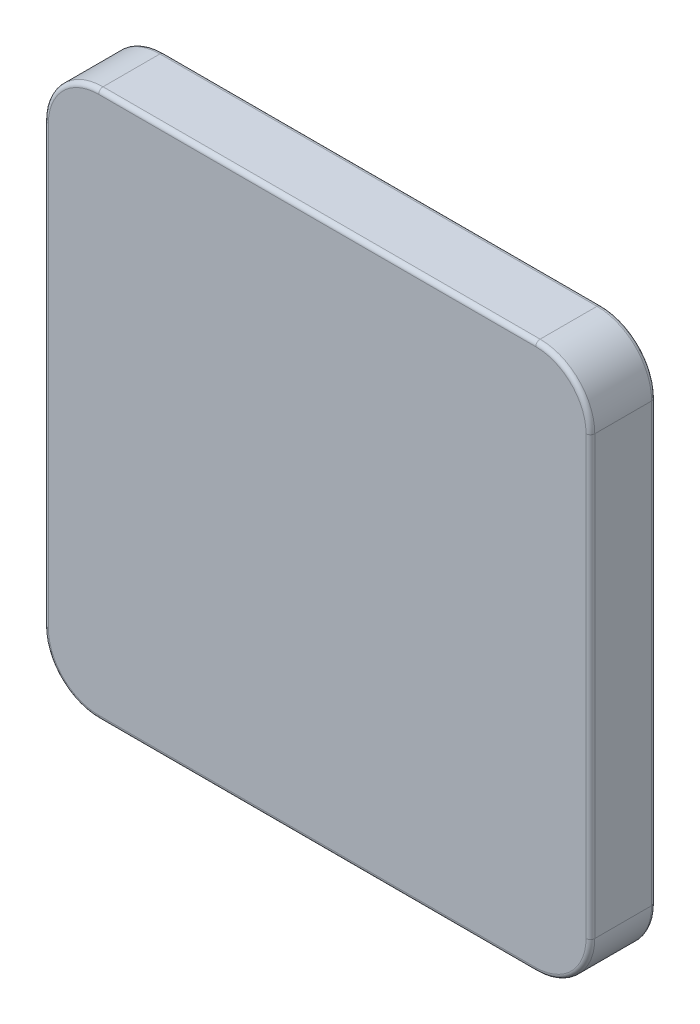
ISO-10303-21;
HEADER;
FILE_DESCRIPTION(('STEP AP214'),'2;1');
FILE_NAME('part.step','',(''),(''),'','','');
FILE_SCHEMA(('AUTOMOTIVE_DESIGN { 1 0 10303 214 1 1 1 1 }'));
ENDSEC;
DATA;
#1=APPLICATION_CONTEXT('core data for automotive mechanical design processes');
#2=APPLICATION_PROTOCOL_DEFINITION('international standard','automotive_design',2000,#1);
#3=PRODUCT_CONTEXT('',#1,'mechanical');
#4=PRODUCT('Part','Part','',(#3));
#5=PRODUCT_RELATED_PRODUCT_CATEGORY('part','',(#4));
#6=PRODUCT_DEFINITION_FORMATION('','',#4);
#7=PRODUCT_DEFINITION_CONTEXT('part definition',#1,'design');
#8=PRODUCT_DEFINITION('design','',#6,#7);
#9=PRODUCT_DEFINITION_SHAPE('','',#8);
#10=(LENGTH_UNIT() NAMED_UNIT(*) SI_UNIT(.MILLI.,.METRE.));
#11=(NAMED_UNIT(*) PLANE_ANGLE_UNIT() SI_UNIT($,.RADIAN.));
#12=(NAMED_UNIT(*) SI_UNIT($,.STERADIAN.) SOLID_ANGLE_UNIT());
#13=UNCERTAINTY_MEASURE_WITH_UNIT(LENGTH_MEASURE(1.E-05),#10,'distance_accuracy_value','');
#14=(GEOMETRIC_REPRESENTATION_CONTEXT(3) GLOBAL_UNCERTAINTY_ASSIGNED_CONTEXT((#13)) GLOBAL_UNIT_ASSIGNED_CONTEXT((#10,
#11,#12)) REPRESENTATION_CONTEXT('',''));
#15=CARTESIAN_POINT('',(0.,0.,0.));
#16=DIRECTION('',(0.,0.,1.));
#17=DIRECTION('',(1.,0.,0.));
#18=AXIS2_PLACEMENT_3D('',#15,#16,#17);
#19=CARTESIAN_POINT('',(-1016.,1016.,304.8));
#20=DIRECTION('',(0.,0.,-1.));
#21=DIRECTION('',(-1.,0.,0.));
#22=AXIS2_PLACEMENT_3D('',#19,#20,#21);
#23=CYLINDRICAL_SURFACE('',#22,254.);
#24=DIRECTION('',(0.,0.,-1.));
#25=VECTOR('',#24,1.);
#26=CARTESIAN_POINT('',(-1016.,1270.,304.8));
#27=LINE('',#26,#25);
#28=CARTESIAN_POINT('',(-1016.,1270.,284.48));
#29=VERTEX_POINT('',#28);
#30=CARTESIAN_POINT('',(-1016.,1270.,20.3200000000001));
#31=VERTEX_POINT('',#30);
#32=EDGE_CURVE('E239',#29,#31,#27,.T.);
#33=ORIENTED_EDGE('',*,*,#32,.T.);
#34=CARTESIAN_POINT('',(-1016.,1016.,20.32));
#35=DIRECTION('',(0.,0.,-1.));
#36=DIRECTION('',(-1.,0.,0.));
#37=AXIS2_PLACEMENT_3D('',#34,#35,#36);
#38=CIRCLE('',#37,254.);
#39=CARTESIAN_POINT('',(-1270.,1016.,20.3200000000001));
#40=VERTEX_POINT('',#39);
#41=EDGE_CURVE('E11',#31,#40,#38,.F.);
#42=ORIENTED_EDGE('',*,*,#41,.T.);
#43=DIRECTION('',(0.,0.,-1.));
#44=VECTOR('',#43,1.);
#45=CARTESIAN_POINT('',(-1270.,1016.,304.8));
#46=LINE('',#45,#44);
#47=CARTESIAN_POINT('',(-1270.,1016.,284.48));
#48=VERTEX_POINT('',#47);
#49=EDGE_CURVE('E178',#48,#40,#46,.T.);
#50=ORIENTED_EDGE('',*,*,#49,.F.);
#51=CARTESIAN_POINT('',(-1016.,1016.,284.48));
#52=DIRECTION('',(0.,0.,-1.));
#53=DIRECTION('',(-1.,0.,0.));
#54=AXIS2_PLACEMENT_3D('',#51,#52,#53);
#55=CIRCLE('',#54,254.);
#56=EDGE_CURVE('E211',#48,#29,#55,.T.);
#57=ORIENTED_EDGE('',*,*,#56,.T.);
#58=EDGE_LOOP('',(#33,#42,#50,#57));
#59=FACE_BOUND('',#58,.T.);
#60=ADVANCED_FACE('F39',(#59),#23,.T.);
#61=CARTESIAN_POINT('',(-1270.,1016.,304.8));
#62=DIRECTION('',(1.,0.,0.));
#63=DIRECTION('',(0.,1.,0.));
#64=AXIS2_PLACEMENT_3D('',#61,#62,#63);
#65=PLANE('',#64);
#66=ORIENTED_EDGE('',*,*,#49,.T.);
#67=DIRECTION('',(0.,-1.,0.));
#68=VECTOR('',#67,1.);
#69=CARTESIAN_POINT('',(-1270.,-1016.,20.32));
#70=LINE('',#69,#68);
#71=CARTESIAN_POINT('',(-1270.,-1016.,20.3200000000001));
#72=VERTEX_POINT('',#71);
#73=EDGE_CURVE('E213',#40,#72,#70,.T.);
#74=ORIENTED_EDGE('',*,*,#73,.T.);
#75=DIRECTION('',(0.,0.,-1.));
#76=VECTOR('',#75,1.);
#77=CARTESIAN_POINT('',(-1270.,-1016.,304.8));
#78=LINE('',#77,#76);
#79=CARTESIAN_POINT('',(-1270.,-1016.,284.48));
#80=VERTEX_POINT('',#79);
#81=EDGE_CURVE('E344',#80,#72,#78,.T.);
#82=ORIENTED_EDGE('',*,*,#81,.F.);
#83=DIRECTION('',(0.,-1.,0.));
#84=VECTOR('',#83,1.);
#85=CARTESIAN_POINT('',(-1270.,1016.,284.48));
#86=LINE('',#85,#84);
#87=EDGE_CURVE('E208',#80,#48,#86,.F.);
#88=ORIENTED_EDGE('',*,*,#87,.T.);
#89=EDGE_LOOP('',(#66,#74,#82,#88));
#90=FACE_BOUND('',#89,.T.);
#91=ADVANCED_FACE('F339',(#90),#65,.F.);
#92=CARTESIAN_POINT('',(-1016.,-1016.,304.8));
#93=DIRECTION('',(0.,0.,-1.));
#94=DIRECTION('',(-1.,0.,0.));
#95=AXIS2_PLACEMENT_3D('',#92,#93,#94);
#96=CYLINDRICAL_SURFACE('',#95,254.);
#97=ORIENTED_EDGE('',*,*,#81,.T.);
#98=CARTESIAN_POINT('',(-1016.,-1016.,20.32));
#99=DIRECTION('',(0.,0.,-1.));
#100=DIRECTION('',(-1.,0.,0.));
#101=AXIS2_PLACEMENT_3D('',#98,#99,#100);
#102=CIRCLE('',#101,254.);
#103=CARTESIAN_POINT('',(-1016.,-1270.,20.3200000000001));
#104=VERTEX_POINT('',#103);
#105=EDGE_CURVE('E268',#72,#104,#102,.F.);
#106=ORIENTED_EDGE('',*,*,#105,.T.);
#107=DIRECTION('',(0.,0.,-1.));
#108=VECTOR('',#107,1.);
#109=CARTESIAN_POINT('',(-1016.,-1270.,304.8));
#110=LINE('',#109,#108);
#111=CARTESIAN_POINT('',(-1016.,-1270.,284.48));
#112=VERTEX_POINT('',#111);
#113=EDGE_CURVE('E347',#112,#104,#110,.T.);
#114=ORIENTED_EDGE('',*,*,#113,.F.);
#115=CARTESIAN_POINT('',(-1016.,-1016.,284.48));
#116=DIRECTION('',(0.,0.,-1.));
#117=DIRECTION('',(-1.,0.,0.));
#118=AXIS2_PLACEMENT_3D('',#115,#116,#117);
#119=CIRCLE('',#118,254.);
#120=EDGE_CURVE('E205',#112,#80,#119,.T.);
#121=ORIENTED_EDGE('',*,*,#120,.T.);
#122=EDGE_LOOP('',(#97,#106,#114,#121));
#123=FACE_BOUND('',#122,.T.);
#124=ADVANCED_FACE('F425',(#123),#96,.T.);
#125=CARTESIAN_POINT('',(-1016.,-1270.,304.8));
#126=DIRECTION('',(0.,1.,0.));
#127=DIRECTION('',(0.,0.,1.));
#128=AXIS2_PLACEMENT_3D('',#125,#126,#127);
#129=PLANE('',#128);
#130=ORIENTED_EDGE('',*,*,#113,.T.);
#131=DIRECTION('',(1.,0.,0.));
#132=VECTOR('',#131,1.);
#133=CARTESIAN_POINT('',(1016.,-1270.,20.32));
#134=LINE('',#133,#132);
#135=CARTESIAN_POINT('',(1016.,-1270.,20.3200000000001));
#136=VERTEX_POINT('',#135);
#137=EDGE_CURVE('E271',#104,#136,#134,.T.);
#138=ORIENTED_EDGE('',*,*,#137,.T.);
#139=DIRECTION('',(0.,0.,-1.));
#140=VECTOR('',#139,1.);
#141=CARTESIAN_POINT('',(1016.,-1270.,304.8));
#142=LINE('',#141,#140);
#143=CARTESIAN_POINT('',(1016.,-1270.,284.48));
#144=VERTEX_POINT('',#143);
#145=EDGE_CURVE('E388',#144,#136,#142,.T.);
#146=ORIENTED_EDGE('',*,*,#145,.F.);
#147=DIRECTION('',(1.,0.,0.));
#148=VECTOR('',#147,1.);
#149=CARTESIAN_POINT('',(-1016.,-1270.,284.48));
#150=LINE('',#149,#148);
#151=EDGE_CURVE('E202',#144,#112,#150,.F.);
#152=ORIENTED_EDGE('',*,*,#151,.T.);
#153=EDGE_LOOP('',(#130,#138,#146,#152));
#154=FACE_BOUND('',#153,.T.);
#155=ADVANCED_FACE('F396',(#154),#129,.F.);
#156=CARTESIAN_POINT('',(1016.,-1016.,304.8));
#157=DIRECTION('',(0.,0.,-1.));
#158=DIRECTION('',(-1.,0.,0.));
#159=AXIS2_PLACEMENT_3D('',#156,#157,#158);
#160=CYLINDRICAL_SURFACE('',#159,254.);
#161=ORIENTED_EDGE('',*,*,#145,.T.);
#162=CARTESIAN_POINT('',(1016.,-1016.,20.32));
#163=DIRECTION('',(0.,0.,-1.));
#164=DIRECTION('',(-1.,0.,0.));
#165=AXIS2_PLACEMENT_3D('',#162,#163,#164);
#166=CIRCLE('',#165,254.);
#167=CARTESIAN_POINT('',(1270.,-1016.,20.3200000000001));
#168=VERTEX_POINT('',#167);
#169=EDGE_CURVE('E274',#136,#168,#166,.F.);
#170=ORIENTED_EDGE('',*,*,#169,.T.);
#171=DIRECTION('',(0.,0.,-1.));
#172=VECTOR('',#171,1.);
#173=CARTESIAN_POINT('',(1270.,-1016.,304.8));
#174=LINE('',#173,#172);
#175=CARTESIAN_POINT('',(1270.,-1016.,284.48));
#176=VERTEX_POINT('',#175);
#177=EDGE_CURVE('E381',#176,#168,#174,.T.);
#178=ORIENTED_EDGE('',*,*,#177,.F.);
#179=CARTESIAN_POINT('',(1016.,-1016.,284.48));
#180=DIRECTION('',(0.,0.,-1.));
#181=DIRECTION('',(-1.,0.,0.));
#182=AXIS2_PLACEMENT_3D('',#179,#180,#181);
#183=CIRCLE('',#182,254.);
#184=EDGE_CURVE('E199',#176,#144,#183,.T.);
#185=ORIENTED_EDGE('',*,*,#184,.T.);
#186=EDGE_LOOP('',(#161,#170,#178,#185));
#187=FACE_BOUND('',#186,.T.);
#188=ADVANCED_FACE('F464',(#187),#160,.T.);
#189=CARTESIAN_POINT('',(1270.,1016.,304.8));
#190=DIRECTION('',(-1.,0.,0.));
#191=DIRECTION('',(0.,-1.,0.));
#192=AXIS2_PLACEMENT_3D('',#189,#190,#191);
#193=PLANE('',#192);
#194=ORIENTED_EDGE('',*,*,#177,.T.);
#195=DIRECTION('',(0.,1.,0.));
#196=VECTOR('',#195,1.);
#197=CARTESIAN_POINT('',(1270.,1016.,20.32));
#198=LINE('',#197,#196);
#199=CARTESIAN_POINT('',(1270.,1016.,20.3200000000001));
#200=VERTEX_POINT('',#199);
#201=EDGE_CURVE('E277',#168,#200,#198,.T.);
#202=ORIENTED_EDGE('',*,*,#201,.T.);
#203=DIRECTION('',(0.,0.,-1.));
#204=VECTOR('',#203,1.);
#205=CARTESIAN_POINT('',(1270.,1016.,304.8));
#206=LINE('',#205,#204);
#207=CARTESIAN_POINT('',(1270.,1016.,284.48));
#208=VERTEX_POINT('',#207);
#209=EDGE_CURVE('E377',#208,#200,#206,.T.);
#210=ORIENTED_EDGE('',*,*,#209,.F.);
#211=DIRECTION('',(0.,1.,0.));
#212=VECTOR('',#211,1.);
#213=CARTESIAN_POINT('',(1270.,1016.,284.48));
#214=LINE('',#213,#212);
#215=EDGE_CURVE('E196',#208,#176,#214,.F.);
#216=ORIENTED_EDGE('',*,*,#215,.T.);
#217=EDGE_LOOP('',(#194,#202,#210,#216));
#218=FACE_BOUND('',#217,.T.);
#219=ADVANCED_FACE('F469',(#218),#193,.F.);
#220=CARTESIAN_POINT('',(1016.,1016.,304.8));
#221=DIRECTION('',(0.,0.,-1.));
#222=DIRECTION('',(-1.,0.,0.));
#223=AXIS2_PLACEMENT_3D('',#220,#221,#222);
#224=CYLINDRICAL_SURFACE('',#223,254.);
#225=ORIENTED_EDGE('',*,*,#209,.T.);
#226=CARTESIAN_POINT('',(1016.,1016.,20.32));
#227=DIRECTION('',(0.,0.,-1.));
#228=DIRECTION('',(-1.,0.,0.));
#229=AXIS2_PLACEMENT_3D('',#226,#227,#228);
#230=CIRCLE('',#229,254.);
#231=CARTESIAN_POINT('',(1016.,1270.,20.3200000000001));
#232=VERTEX_POINT('',#231);
#233=EDGE_CURVE('E64',#200,#232,#230,.F.);
#234=ORIENTED_EDGE('',*,*,#233,.T.);
#235=DIRECTION('',(0.,0.,-1.));
#236=VECTOR('',#235,1.);
#237=CARTESIAN_POINT('',(1016.,1270.,304.8));
#238=LINE('',#237,#236);
#239=CARTESIAN_POINT('',(1016.,1270.,284.48));
#240=VERTEX_POINT('',#239);
#241=EDGE_CURVE('E374',#240,#232,#238,.T.);
#242=ORIENTED_EDGE('',*,*,#241,.F.);
#243=CARTESIAN_POINT('',(1016.,1016.,284.48));
#244=DIRECTION('',(0.,0.,-1.));
#245=DIRECTION('',(-1.,0.,0.));
#246=AXIS2_PLACEMENT_3D('',#243,#244,#245);
#247=CIRCLE('',#246,254.);
#248=EDGE_CURVE('E188',#240,#208,#247,.T.);
#249=ORIENTED_EDGE('',*,*,#248,.T.);
#250=EDGE_LOOP('',(#225,#234,#242,#249));
#251=FACE_BOUND('',#250,.T.);
#252=ADVANCED_FACE('F375',(#251),#224,.T.);
#253=CARTESIAN_POINT('',(-1016.,1270.,304.8));
#254=DIRECTION('',(0.,-1.,0.));
#255=DIRECTION('',(0.,0.,-1.));
#256=AXIS2_PLACEMENT_3D('',#253,#254,#255);
#257=PLANE('',#256);
#258=ORIENTED_EDGE('',*,*,#241,.T.);
#259=DIRECTION('',(-1.,0.,0.));
#260=VECTOR('',#259,1.);
#261=CARTESIAN_POINT('',(-1016.,1270.,20.32));
#262=LINE('',#261,#260);
#263=EDGE_CURVE('E49',#232,#31,#262,.T.);
#264=ORIENTED_EDGE('',*,*,#263,.T.);
#265=ORIENTED_EDGE('',*,*,#32,.F.);
#266=DIRECTION('',(-1.,0.,0.));
#267=VECTOR('',#266,1.);
#268=CARTESIAN_POINT('',(-1016.,1270.,284.48));
#269=LINE('',#268,#267);
#270=EDGE_CURVE('E163',#29,#240,#269,.F.);
#271=ORIENTED_EDGE('',*,*,#270,.T.);
#272=EDGE_LOOP('',(#258,#264,#265,#271));
#273=FACE_BOUND('',#272,.T.);
#274=ADVANCED_FACE('F373',(#273),#257,.F.);
#275=CARTESIAN_POINT('',(-1016.,1016.,304.8));
#276=DIRECTION('',(0.,0.,-1.));
#277=DIRECTION('',(-1.,0.,0.));
#278=AXIS2_PLACEMENT_3D('',#275,#276,#277);
#279=PLANE('',#278);
#280=CARTESIAN_POINT('',(1016.,1016.,304.8));
#281=DIRECTION('',(0.,0.,-1.));
#282=DIRECTION('',(-1.,0.,0.));
#283=AXIS2_PLACEMENT_3D('',#280,#281,#282);
#284=CIRCLE('',#283,233.68);
#285=CARTESIAN_POINT('',(1249.68,1016.,304.8));
#286=VERTEX_POINT('',#285);
#287=CARTESIAN_POINT('',(1016.,1249.68,304.8));
#288=VERTEX_POINT('',#287);
#289=EDGE_CURVE('E182',#286,#288,#284,.F.);
#290=ORIENTED_EDGE('',*,*,#289,.T.);
#291=DIRECTION('',(-1.,0.,0.));
#292=VECTOR('',#291,1.);
#293=CARTESIAN_POINT('',(-1016.,1249.68,304.8));
#294=LINE('',#293,#292);
#295=CARTESIAN_POINT('',(-1016.,1249.68,304.8));
#296=VERTEX_POINT('',#295);
#297=EDGE_CURVE('E161',#288,#296,#294,.T.);
#298=ORIENTED_EDGE('',*,*,#297,.T.);
#299=CARTESIAN_POINT('',(-1016.,1016.,304.8));
#300=DIRECTION('',(0.,0.,-1.));
#301=DIRECTION('',(-1.,0.,0.));
#302=AXIS2_PLACEMENT_3D('',#299,#300,#301);
#303=CIRCLE('',#302,233.68);
#304=CARTESIAN_POINT('',(-1249.68,1016.,304.8));
#305=VERTEX_POINT('',#304);
#306=EDGE_CURVE('E170',#296,#305,#303,.F.);
#307=ORIENTED_EDGE('',*,*,#306,.T.);
#308=DIRECTION('',(0.,-1.,0.));
#309=VECTOR('',#308,1.);
#310=CARTESIAN_POINT('',(-1249.68,1016.,304.8));
#311=LINE('',#310,#309);
#312=CARTESIAN_POINT('',(-1249.68,-1016.,304.8));
#313=VERTEX_POINT('',#312);
#314=EDGE_CURVE('E177',#305,#313,#311,.T.);
#315=ORIENTED_EDGE('',*,*,#314,.T.);
#316=CARTESIAN_POINT('',(-1016.,-1016.,304.8));
#317=DIRECTION('',(0.,0.,-1.));
#318=DIRECTION('',(-1.,0.,0.));
#319=AXIS2_PLACEMENT_3D('',#316,#317,#318);
#320=CIRCLE('',#319,233.68);
#321=CARTESIAN_POINT('',(-1016.,-1249.68,304.8));
#322=VERTEX_POINT('',#321);
#323=EDGE_CURVE('E353',#313,#322,#320,.F.);
#324=ORIENTED_EDGE('',*,*,#323,.T.);
#325=DIRECTION('',(1.,0.,0.));
#326=VECTOR('',#325,1.);
#327=CARTESIAN_POINT('',(-1016.,-1249.68,304.8));
#328=LINE('',#327,#326);
#329=CARTESIAN_POINT('',(1016.,-1249.68,304.8));
#330=VERTEX_POINT('',#329);
#331=EDGE_CURVE('E356',#322,#330,#328,.T.);
#332=ORIENTED_EDGE('',*,*,#331,.T.);
#333=CARTESIAN_POINT('',(1016.,-1016.,304.8));
#334=DIRECTION('',(0.,0.,-1.));
#335=DIRECTION('',(-1.,0.,0.));
#336=AXIS2_PLACEMENT_3D('',#333,#334,#335);
#337=CIRCLE('',#336,233.68);
#338=CARTESIAN_POINT('',(1249.68,-1016.,304.8));
#339=VERTEX_POINT('',#338);
#340=EDGE_CURVE('E359',#330,#339,#337,.F.);
#341=ORIENTED_EDGE('',*,*,#340,.T.);
#342=DIRECTION('',(0.,1.,0.));
#343=VECTOR('',#342,1.);
#344=CARTESIAN_POINT('',(1249.68,1016.,304.8));
#345=LINE('',#344,#343);
#346=EDGE_CURVE('E190',#339,#286,#345,.T.);
#347=ORIENTED_EDGE('',*,*,#346,.T.);
#348=EDGE_LOOP('',(#290,#298,#307,#315,#324,#332,#341,#347));
#349=FACE_BOUND('',#348,.T.);
#350=ADVANCED_FACE('F180',(#349),#279,.F.);
#351=CARTESIAN_POINT('',(-1016.,1016.,0.));
#352=DIRECTION('',(0.,0.,-1.));
#353=DIRECTION('',(-1.,0.,0.));
#354=AXIS2_PLACEMENT_3D('',#351,#352,#353);
#355=PLANE('',#354);
#356=CARTESIAN_POINT('',(-1016.,-1016.,0.));
#357=DIRECTION('',(0.,0.,-1.));
#358=DIRECTION('',(-1.,0.,0.));
#359=AXIS2_PLACEMENT_3D('',#356,#357,#358);
#360=CIRCLE('',#359,233.68);
#361=CARTESIAN_POINT('',(-1016.,-1249.68,0.));
#362=VERTEX_POINT('',#361);
#363=CARTESIAN_POINT('',(-1249.68,-1016.,0.));
#364=VERTEX_POINT('',#363);
#365=EDGE_CURVE('E261',#362,#364,#360,.T.);
#366=ORIENTED_EDGE('',*,*,#365,.T.);
#367=DIRECTION('',(0.,-1.,0.));
#368=VECTOR('',#367,1.);
#369=CARTESIAN_POINT('',(-1249.68,1016.,0.));
#370=LINE('',#369,#368);
#371=CARTESIAN_POINT('',(-1249.68,1016.,0.));
#372=VERTEX_POINT('',#371);
#373=EDGE_CURVE('E264',#364,#372,#370,.F.);
#374=ORIENTED_EDGE('',*,*,#373,.T.);
#375=CARTESIAN_POINT('',(-1016.,1016.,0.));
#376=DIRECTION('',(0.,0.,-1.));
#377=DIRECTION('',(-1.,0.,0.));
#378=AXIS2_PLACEMENT_3D('',#375,#376,#377);
#379=CIRCLE('',#378,233.68);
#380=CARTESIAN_POINT('',(-1016.,1249.68,0.));
#381=VERTEX_POINT('',#380);
#382=EDGE_CURVE('E243',#372,#381,#379,.T.);
#383=ORIENTED_EDGE('',*,*,#382,.T.);
#384=DIRECTION('',(-1.,0.,0.));
#385=VECTOR('',#384,1.);
#386=CARTESIAN_POINT('',(1016.,1249.68,0.));
#387=LINE('',#386,#385);
#388=CARTESIAN_POINT('',(1016.,1249.68,0.));
#389=VERTEX_POINT('',#388);
#390=EDGE_CURVE('E246',#381,#389,#387,.F.);
#391=ORIENTED_EDGE('',*,*,#390,.T.);
#392=CARTESIAN_POINT('',(1016.,1016.,0.));
#393=DIRECTION('',(0.,0.,-1.));
#394=DIRECTION('',(-1.,0.,0.));
#395=AXIS2_PLACEMENT_3D('',#392,#393,#394);
#396=CIRCLE('',#395,233.68);
#397=CARTESIAN_POINT('',(1249.68,1016.,0.));
#398=VERTEX_POINT('',#397);
#399=EDGE_CURVE('E249',#389,#398,#396,.T.);
#400=ORIENTED_EDGE('',*,*,#399,.T.);
#401=DIRECTION('',(0.,1.,0.));
#402=VECTOR('',#401,1.);
#403=CARTESIAN_POINT('',(1249.68,-1016.,0.));
#404=LINE('',#403,#402);
#405=CARTESIAN_POINT('',(1249.68,-1016.,0.));
#406=VERTEX_POINT('',#405);
#407=EDGE_CURVE('E252',#398,#406,#404,.F.);
#408=ORIENTED_EDGE('',*,*,#407,.T.);
#409=CARTESIAN_POINT('',(1016.,-1016.,0.));
#410=DIRECTION('',(0.,0.,-1.));
#411=DIRECTION('',(-1.,0.,0.));
#412=AXIS2_PLACEMENT_3D('',#409,#410,#411);
#413=CIRCLE('',#412,233.68);
#414=CARTESIAN_POINT('',(1016.,-1249.68,0.));
#415=VERTEX_POINT('',#414);
#416=EDGE_CURVE('E255',#406,#415,#413,.T.);
#417=ORIENTED_EDGE('',*,*,#416,.T.);
#418=DIRECTION('',(1.,0.,0.));
#419=VECTOR('',#418,1.);
#420=CARTESIAN_POINT('',(-1016.,-1249.68,0.));
#421=LINE('',#420,#419);
#422=EDGE_CURVE('E258',#415,#362,#421,.F.);
#423=ORIENTED_EDGE('',*,*,#422,.T.);
#424=EDGE_LOOP('',(#366,#374,#383,#391,#400,#408,#417,#423));
#425=FACE_BOUND('',#424,.T.);
#426=ADVANCED_FACE('F323',(#425),#355,.T.);
#427=CARTESIAN_POINT('',(-1016.,-1249.68,284.48));
#428=DIRECTION('',(1.,0.,0.));
#429=DIRECTION('',(0.,0.,-1.));
#430=AXIS2_PLACEMENT_3D('',#427,#428,#429);
#431=CYLINDRICAL_SURFACE('',#430,20.32);
#432=CARTESIAN_POINT('',(-1016.,-1249.68,284.48));
#433=DIRECTION('',(-1.,0.,0.));
#434=DIRECTION('',(0.,0.,1.));
#435=AXIS2_PLACEMENT_3D('',#432,#433,#434);
#436=CIRCLE('',#435,20.32);
#437=EDGE_CURVE('E231',#112,#322,#436,.T.);
#438=ORIENTED_EDGE('',*,*,#437,.F.);
#439=ORIENTED_EDGE('',*,*,#151,.F.);
#440=CARTESIAN_POINT('',(1016.,-1249.68,284.48));
#441=DIRECTION('',(1.,0.,0.));
#442=DIRECTION('',(0.,1.,0.));
#443=AXIS2_PLACEMENT_3D('',#440,#441,#442);
#444=CIRCLE('',#443,20.32);
#445=EDGE_CURVE('E235',#330,#144,#444,.T.);
#446=ORIENTED_EDGE('',*,*,#445,.F.);
#447=ORIENTED_EDGE('',*,*,#331,.F.);
#448=EDGE_LOOP('',(#438,#439,#446,#447));
#449=FACE_BOUND('',#448,.T.);
#450=ADVANCED_FACE('F447',(#449),#431,.T.);
#451=CARTESIAN_POINT('',(1016.,-1016.,284.48));
#452=DIRECTION('',(0.,0.,-1.));
#453=DIRECTION('',(-1.,0.,0.));
#454=AXIS2_PLACEMENT_3D('',#451,#452,#453);
#455=TOROIDAL_SURFACE('',#454,233.68,20.32);
#456=ORIENTED_EDGE('',*,*,#445,.T.);
#457=ORIENTED_EDGE('',*,*,#184,.F.);
#458=CARTESIAN_POINT('',(1249.68,-1016.,284.48));
#459=DIRECTION('',(0.,1.,0.));
#460=DIRECTION('',(0.,0.,1.));
#461=AXIS2_PLACEMENT_3D('',#458,#459,#460);
#462=CIRCLE('',#461,20.32);
#463=EDGE_CURVE('E227',#339,#176,#462,.T.);
#464=ORIENTED_EDGE('',*,*,#463,.F.);
#465=ORIENTED_EDGE('',*,*,#340,.F.);
#466=EDGE_LOOP('',(#456,#457,#464,#465));
#467=FACE_BOUND('',#466,.T.);
#468=ADVANCED_FACE('F444',(#467),#455,.T.);
#469=CARTESIAN_POINT('',(-1016.,-1016.,284.48));
#470=DIRECTION('',(0.,0.,-1.));
#471=DIRECTION('',(-1.,0.,0.));
#472=AXIS2_PLACEMENT_3D('',#469,#470,#471);
#473=TOROIDAL_SURFACE('',#472,233.68,20.32);
#474=ORIENTED_EDGE('',*,*,#437,.T.);
#475=ORIENTED_EDGE('',*,*,#323,.F.);
#476=CARTESIAN_POINT('',(-1249.68,-1016.,284.48));
#477=DIRECTION('',(0.,1.,0.));
#478=DIRECTION('',(-1.,0.,0.));
#479=AXIS2_PLACEMENT_3D('',#476,#477,#478);
#480=CIRCLE('',#479,20.32);
#481=EDGE_CURVE('E223',#80,#313,#480,.T.);
#482=ORIENTED_EDGE('',*,*,#481,.F.);
#483=ORIENTED_EDGE('',*,*,#120,.F.);
#484=EDGE_LOOP('',(#474,#475,#482,#483));
#485=FACE_BOUND('',#484,.T.);
#486=ADVANCED_FACE('F441',(#485),#473,.T.);
#487=CARTESIAN_POINT('',(1249.68,1016.,284.48));
#488=DIRECTION('',(0.,1.,0.));
#489=DIRECTION('',(-1.,0.,0.));
#490=AXIS2_PLACEMENT_3D('',#487,#488,#489);
#491=CYLINDRICAL_SURFACE('',#490,20.32);
#492=ORIENTED_EDGE('',*,*,#463,.T.);
#493=ORIENTED_EDGE('',*,*,#215,.F.);
#494=CARTESIAN_POINT('',(1249.68,1016.,284.48));
#495=DIRECTION('',(0.,1.,0.));
#496=DIRECTION('',(-1.,0.,0.));
#497=AXIS2_PLACEMENT_3D('',#494,#495,#496);
#498=CIRCLE('',#497,20.32);
#499=EDGE_CURVE('E219',#286,#208,#498,.T.);
#500=ORIENTED_EDGE('',*,*,#499,.F.);
#501=ORIENTED_EDGE('',*,*,#346,.F.);
#502=EDGE_LOOP('',(#492,#493,#500,#501));
#503=FACE_BOUND('',#502,.T.);
#504=ADVANCED_FACE('F368',(#503),#491,.T.);
#505=CARTESIAN_POINT('',(-1249.68,1016.,284.48));
#506=DIRECTION('',(0.,-1.,0.));
#507=DIRECTION('',(1.,0.,0.));
#508=AXIS2_PLACEMENT_3D('',#505,#506,#507);
#509=CYLINDRICAL_SURFACE('',#508,20.32);
#510=ORIENTED_EDGE('',*,*,#481,.T.);
#511=ORIENTED_EDGE('',*,*,#314,.F.);
#512=CARTESIAN_POINT('',(-1249.68,1016.,284.48));
#513=DIRECTION('',(0.,1.,0.));
#514=DIRECTION('',(0.,0.,1.));
#515=AXIS2_PLACEMENT_3D('',#512,#513,#514);
#516=CIRCLE('',#515,20.32);
#517=EDGE_CURVE('E173',#48,#305,#516,.T.);
#518=ORIENTED_EDGE('',*,*,#517,.F.);
#519=ORIENTED_EDGE('',*,*,#87,.F.);
#520=EDGE_LOOP('',(#510,#511,#518,#519));
#521=FACE_BOUND('',#520,.T.);
#522=ADVANCED_FACE('F435',(#521),#509,.T.);
#523=CARTESIAN_POINT('',(1016.,1016.,284.48));
#524=DIRECTION('',(0.,0.,-1.));
#525=DIRECTION('',(-1.,0.,0.));
#526=AXIS2_PLACEMENT_3D('',#523,#524,#525);
#527=TOROIDAL_SURFACE('',#526,233.68,20.32);
#528=ORIENTED_EDGE('',*,*,#499,.T.);
#529=ORIENTED_EDGE('',*,*,#248,.F.);
#530=CARTESIAN_POINT('',(1016.,1249.68,284.48));
#531=DIRECTION('',(-1.,0.,0.));
#532=DIRECTION('',(0.,0.,1.));
#533=AXIS2_PLACEMENT_3D('',#530,#531,#532);
#534=CIRCLE('',#533,20.32);
#535=EDGE_CURVE('E167',#288,#240,#534,.T.);
#536=ORIENTED_EDGE('',*,*,#535,.F.);
#537=ORIENTED_EDGE('',*,*,#289,.F.);
#538=EDGE_LOOP('',(#528,#529,#536,#537));
#539=FACE_BOUND('',#538,.T.);
#540=ADVANCED_FACE('F371',(#539),#527,.T.);
#541=CARTESIAN_POINT('',(-1016.,1016.,284.48));
#542=DIRECTION('',(0.,0.,-1.));
#543=DIRECTION('',(-1.,0.,0.));
#544=AXIS2_PLACEMENT_3D('',#541,#542,#543);
#545=TOROIDAL_SURFACE('',#544,233.68,20.32);
#546=ORIENTED_EDGE('',*,*,#517,.T.);
#547=ORIENTED_EDGE('',*,*,#306,.F.);
#548=CARTESIAN_POINT('',(-1016.,1249.68,284.48));
#549=DIRECTION('',(1.,0.,0.));
#550=DIRECTION('',(0.,1.,0.));
#551=AXIS2_PLACEMENT_3D('',#548,#549,#550);
#552=CIRCLE('',#551,20.32);
#553=EDGE_CURVE('E157',#29,#296,#552,.T.);
#554=ORIENTED_EDGE('',*,*,#553,.F.);
#555=ORIENTED_EDGE('',*,*,#56,.F.);
#556=EDGE_LOOP('',(#546,#547,#554,#555));
#557=FACE_BOUND('',#556,.T.);
#558=ADVANCED_FACE('F171',(#557),#545,.T.);
#559=CARTESIAN_POINT('',(-1016.,1249.68,284.48));
#560=DIRECTION('',(-1.,0.,0.));
#561=DIRECTION('',(0.,0.,1.));
#562=AXIS2_PLACEMENT_3D('',#559,#560,#561);
#563=CYLINDRICAL_SURFACE('',#562,20.32);
#564=ORIENTED_EDGE('',*,*,#535,.T.);
#565=ORIENTED_EDGE('',*,*,#270,.F.);
#566=ORIENTED_EDGE('',*,*,#553,.T.);
#567=ORIENTED_EDGE('',*,*,#297,.F.);
#568=EDGE_LOOP('',(#564,#565,#566,#567));
#569=FACE_BOUND('',#568,.T.);
#570=ADVANCED_FACE('F159',(#569),#563,.T.);
#571=CARTESIAN_POINT('',(1249.68,1016.,20.32));
#572=DIRECTION('',(0.,-1.,0.));
#573=DIRECTION('',(1.,0.,0.));
#574=AXIS2_PLACEMENT_3D('',#571,#572,#573);
#575=CYLINDRICAL_SURFACE('',#574,20.32);
#576=CARTESIAN_POINT('',(1249.68,-1016.,20.32));
#577=DIRECTION('',(0.,-1.,0.));
#578=DIRECTION('',(0.,0.,-1.));
#579=AXIS2_PLACEMENT_3D('',#576,#577,#578);
#580=CIRCLE('',#579,20.32);
#581=EDGE_CURVE('E305',#406,#168,#580,.T.);
#582=ORIENTED_EDGE('',*,*,#581,.F.);
#583=ORIENTED_EDGE('',*,*,#407,.F.);
#584=CARTESIAN_POINT('',(1249.68,1016.,20.32));
#585=DIRECTION('',(0.,1.,0.));
#586=DIRECTION('',(0.,0.,1.));
#587=AXIS2_PLACEMENT_3D('',#584,#585,#586);
#588=CIRCLE('',#587,20.32);
#589=EDGE_CURVE('E43',#200,#398,#588,.T.);
#590=ORIENTED_EDGE('',*,*,#589,.F.);
#591=ORIENTED_EDGE('',*,*,#201,.F.);
#592=EDGE_LOOP('',(#582,#583,#590,#591));
#593=FACE_BOUND('',#592,.T.);
#594=ADVANCED_FACE('F41',(#593),#575,.T.);
#595=CARTESIAN_POINT('',(1016.,1016.,20.32));
#596=DIRECTION('',(0.,0.,-1.));
#597=DIRECTION('',(-1.,0.,0.));
#598=AXIS2_PLACEMENT_3D('',#595,#596,#597);
#599=TOROIDAL_SURFACE('',#598,233.68,20.32);
#600=ORIENTED_EDGE('',*,*,#589,.T.);
#601=ORIENTED_EDGE('',*,*,#399,.F.);
#602=CARTESIAN_POINT('',(1016.,1249.68,20.32));
#603=DIRECTION('',(-1.,0.,0.));
#604=DIRECTION('',(0.,-1.,0.));
#605=AXIS2_PLACEMENT_3D('',#602,#603,#604);
#606=CIRCLE('',#605,20.32);
#607=EDGE_CURVE('E302',#232,#389,#606,.T.);
#608=ORIENTED_EDGE('',*,*,#607,.F.);
#609=ORIENTED_EDGE('',*,*,#233,.F.);
#610=EDGE_LOOP('',(#600,#601,#608,#609));
#611=FACE_BOUND('',#610,.T.);
#612=ADVANCED_FACE('F317',(#611),#599,.T.);
#613=CARTESIAN_POINT('',(1016.,-1016.,20.32));
#614=DIRECTION('',(0.,0.,-1.));
#615=DIRECTION('',(-1.,0.,0.));
#616=AXIS2_PLACEMENT_3D('',#613,#614,#615);
#617=TOROIDAL_SURFACE('',#616,233.68,20.32);
#618=ORIENTED_EDGE('',*,*,#581,.T.);
#619=ORIENTED_EDGE('',*,*,#169,.F.);
#620=CARTESIAN_POINT('',(1016.,-1249.68,20.32));
#621=DIRECTION('',(-1.,0.,0.));
#622=DIRECTION('',(0.,0.,1.));
#623=AXIS2_PLACEMENT_3D('',#620,#621,#622);
#624=CIRCLE('',#623,20.32);
#625=EDGE_CURVE('E298',#415,#136,#624,.T.);
#626=ORIENTED_EDGE('',*,*,#625,.F.);
#627=ORIENTED_EDGE('',*,*,#416,.F.);
#628=EDGE_LOOP('',(#618,#619,#626,#627));
#629=FACE_BOUND('',#628,.T.);
#630=ADVANCED_FACE('F508',(#629),#617,.T.);
#631=CARTESIAN_POINT('',(-1016.,1249.68,20.32));
#632=DIRECTION('',(1.,0.,0.));
#633=DIRECTION('',(0.,0.,-1.));
#634=AXIS2_PLACEMENT_3D('',#631,#632,#633);
#635=CYLINDRICAL_SURFACE('',#634,20.32);
#636=ORIENTED_EDGE('',*,*,#607,.T.);
#637=ORIENTED_EDGE('',*,*,#390,.F.);
#638=CARTESIAN_POINT('',(-1016.,1249.68,20.32));
#639=DIRECTION('',(-1.,0.,0.));
#640=DIRECTION('',(0.,0.,1.));
#641=AXIS2_PLACEMENT_3D('',#638,#639,#640);
#642=CIRCLE('',#641,20.32);
#643=EDGE_CURVE('E294',#31,#381,#642,.T.);
#644=ORIENTED_EDGE('',*,*,#643,.F.);
#645=ORIENTED_EDGE('',*,*,#263,.F.);
#646=EDGE_LOOP('',(#636,#637,#644,#645));
#647=FACE_BOUND('',#646,.T.);
#648=ADVANCED_FACE('F329',(#647),#635,.T.);
#649=CARTESIAN_POINT('',(-1016.,-1249.68,20.32));
#650=DIRECTION('',(-1.,0.,0.));
#651=DIRECTION('',(0.,0.,1.));
#652=AXIS2_PLACEMENT_3D('',#649,#650,#651);
#653=CYLINDRICAL_SURFACE('',#652,20.32);
#654=ORIENTED_EDGE('',*,*,#625,.T.);
#655=ORIENTED_EDGE('',*,*,#137,.F.);
#656=CARTESIAN_POINT('',(-1016.,-1249.68,20.32));
#657=DIRECTION('',(-1.,0.,0.));
#658=DIRECTION('',(0.,-1.,0.));
#659=AXIS2_PLACEMENT_3D('',#656,#657,#658);
#660=CIRCLE('',#659,20.32);
#661=EDGE_CURVE('E290',#362,#104,#660,.T.);
#662=ORIENTED_EDGE('',*,*,#661,.F.);
#663=ORIENTED_EDGE('',*,*,#422,.F.);
#664=EDGE_LOOP('',(#654,#655,#662,#663));
#665=FACE_BOUND('',#664,.T.);
#666=ADVANCED_FACE('F403',(#665),#653,.T.);
#667=CARTESIAN_POINT('',(-1016.,1016.,20.32));
#668=DIRECTION('',(0.,0.,-1.));
#669=DIRECTION('',(-1.,0.,0.));
#670=AXIS2_PLACEMENT_3D('',#667,#668,#669);
#671=TOROIDAL_SURFACE('',#670,233.68,20.32);
#672=ORIENTED_EDGE('',*,*,#643,.T.);
#673=ORIENTED_EDGE('',*,*,#382,.F.);
#674=CARTESIAN_POINT('',(-1249.68,1016.,20.32));
#675=DIRECTION('',(0.,-1.,0.));
#676=DIRECTION('',(1.,0.,0.));
#677=AXIS2_PLACEMENT_3D('',#674,#675,#676);
#678=CIRCLE('',#677,20.32);
#679=EDGE_CURVE('E287',#40,#372,#678,.T.);
#680=ORIENTED_EDGE('',*,*,#679,.F.);
#681=ORIENTED_EDGE('',*,*,#41,.F.);
#682=EDGE_LOOP('',(#672,#673,#680,#681));
#683=FACE_BOUND('',#682,.T.);
#684=ADVANCED_FACE('F332',(#683),#671,.T.);
#685=CARTESIAN_POINT('',(-1016.,-1016.,20.32));
#686=DIRECTION('',(0.,0.,-1.));
#687=DIRECTION('',(-1.,0.,0.));
#688=AXIS2_PLACEMENT_3D('',#685,#686,#687);
#689=TOROIDAL_SURFACE('',#688,233.68,20.32);
#690=ORIENTED_EDGE('',*,*,#661,.T.);
#691=ORIENTED_EDGE('',*,*,#105,.F.);
#692=CARTESIAN_POINT('',(-1249.68,-1016.,20.32));
#693=DIRECTION('',(0.,1.,0.));
#694=DIRECTION('',(0.,0.,1.));
#695=AXIS2_PLACEMENT_3D('',#692,#693,#694);
#696=CIRCLE('',#695,20.32);
#697=EDGE_CURVE('E284',#364,#72,#696,.T.);
#698=ORIENTED_EDGE('',*,*,#697,.F.);
#699=ORIENTED_EDGE('',*,*,#365,.F.);
#700=EDGE_LOOP('',(#690,#691,#698,#699));
#701=FACE_BOUND('',#700,.T.);
#702=ADVANCED_FACE('F408',(#701),#689,.T.);
#703=CARTESIAN_POINT('',(-1249.68,1016.,20.32));
#704=DIRECTION('',(0.,1.,0.));
#705=DIRECTION('',(-1.,0.,0.));
#706=AXIS2_PLACEMENT_3D('',#703,#704,#705);
#707=CYLINDRICAL_SURFACE('',#706,20.32);
#708=ORIENTED_EDGE('',*,*,#679,.T.);
#709=ORIENTED_EDGE('',*,*,#373,.F.);
#710=ORIENTED_EDGE('',*,*,#697,.T.);
#711=ORIENTED_EDGE('',*,*,#73,.F.);
#712=EDGE_LOOP('',(#708,#709,#710,#711));
#713=FACE_BOUND('',#712,.T.);
#714=ADVANCED_FACE('F412',(#713),#707,.T.);
#715=CLOSED_SHELL('',(#60,#91,#124,#155,#188,#219,#252,#274,#350,#426,#450,#468,#486,#504,#522,
#540,#558,#570,#594,#612,#630,#648,#666,#684,#702,#714));
#716=MANIFOLD_SOLID_BREP('B2',#715);
#717=ADVANCED_BREP_SHAPE_REPRESENTATION('',(#18,#716),#14);
#718=SHAPE_DEFINITION_REPRESENTATION(#9,#717);
ENDSEC;
END-ISO-10303-21;
